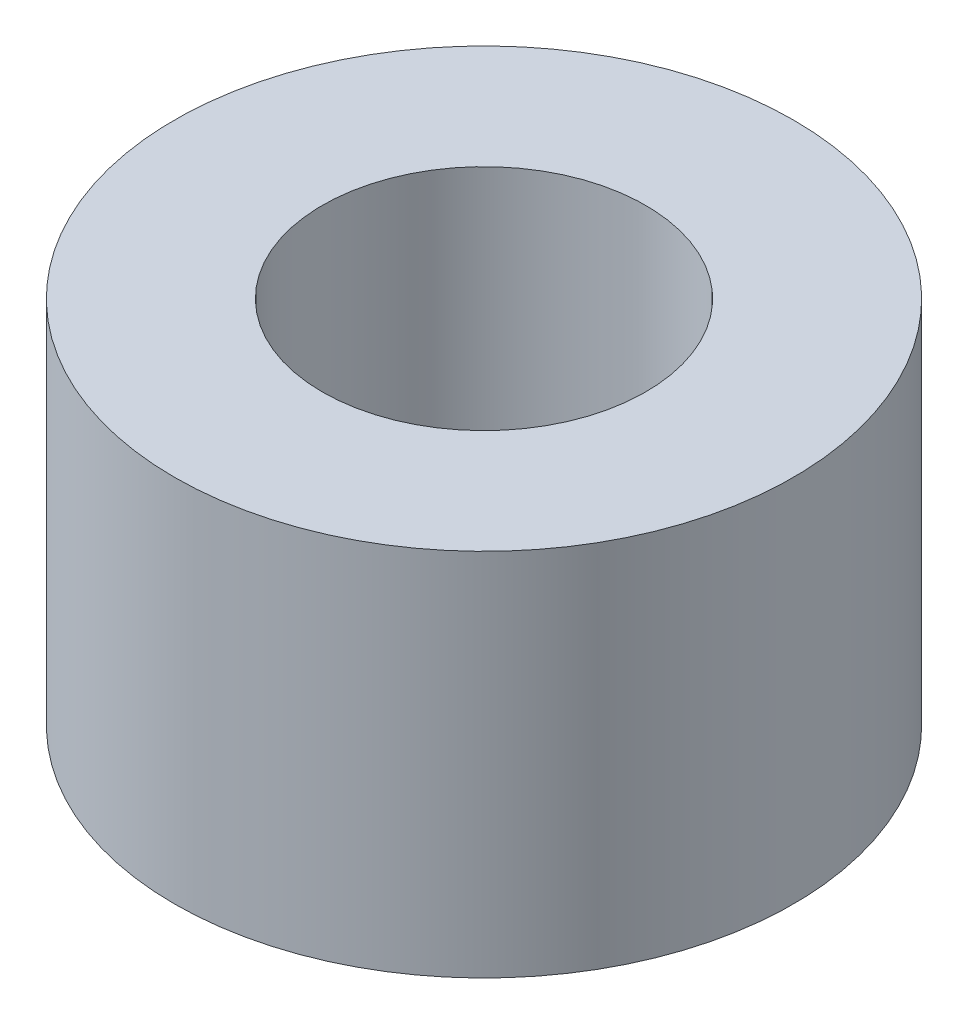
ISO-10303-21;
HEADER;
FILE_DESCRIPTION(('STEP AP214'),'2;1');
FILE_NAME('part.step','',(''),(''),'','','');
FILE_SCHEMA(('AUTOMOTIVE_DESIGN { 1 0 10303 214 1 1 1 1 }'));
ENDSEC;
DATA;
#1=APPLICATION_CONTEXT('core data for automotive mechanical design processes');
#2=APPLICATION_PROTOCOL_DEFINITION('international standard','automotive_design',2000,#1);
#3=PRODUCT_CONTEXT('',#1,'mechanical');
#4=PRODUCT('Part','Part','',(#3));
#5=PRODUCT_RELATED_PRODUCT_CATEGORY('part','',(#4));
#6=PRODUCT_DEFINITION_FORMATION('','',#4);
#7=PRODUCT_DEFINITION_CONTEXT('part definition',#1,'design');
#8=PRODUCT_DEFINITION('design','',#6,#7);
#9=PRODUCT_DEFINITION_SHAPE('','',#8);
#10=(LENGTH_UNIT() NAMED_UNIT(*) SI_UNIT(.MILLI.,.METRE.));
#11=(NAMED_UNIT(*) PLANE_ANGLE_UNIT() SI_UNIT($,.RADIAN.));
#12=(NAMED_UNIT(*) SI_UNIT($,.STERADIAN.) SOLID_ANGLE_UNIT());
#13=UNCERTAINTY_MEASURE_WITH_UNIT(LENGTH_MEASURE(1.E-05),#10,'distance_accuracy_value','');
#14=(GEOMETRIC_REPRESENTATION_CONTEXT(3) GLOBAL_UNCERTAINTY_ASSIGNED_CONTEXT((#13)) GLOBAL_UNIT_ASSIGNED_CONTEXT((#10,
#11,#12)) REPRESENTATION_CONTEXT('',''));
#15=CARTESIAN_POINT('',(0.,0.,0.));
#16=DIRECTION('',(0.,0.,1.));
#17=DIRECTION('',(1.,0.,0.));
#18=AXIS2_PLACEMENT_3D('',#15,#16,#17);
#19=CARTESIAN_POINT('',(0.,4.,0.));
#20=DIRECTION('',(0.,1.,0.));
#21=DIRECTION('',(0.,0.,1.));
#22=AXIS2_PLACEMENT_3D('',#19,#20,#21);
#23=PLANE('',#22);
#24=CARTESIAN_POINT('',(0.,4.,0.));
#25=DIRECTION('',(0.,1.,0.));
#26=DIRECTION('',(0.,0.,1.));
#27=AXIS2_PLACEMENT_3D('',#24,#25,#26);
#28=CIRCLE('',#27,3.35);
#29=CARTESIAN_POINT('',(0.,4.,3.35));
#30=VERTEX_POINT('',#29);
#31=EDGE_CURVE('E10',#30,#30,#28,.T.);
#32=ORIENTED_EDGE('',*,*,#31,.T.);
#33=EDGE_LOOP('',(#32));
#34=FACE_BOUND('',#33,.T.);
#35=CARTESIAN_POINT('',(0.,4.,0.));
#36=DIRECTION('',(0.,1.,0.));
#37=DIRECTION('',(0.,0.,1.));
#38=AXIS2_PLACEMENT_3D('',#35,#36,#37);
#39=CIRCLE('',#38,1.75);
#40=CARTESIAN_POINT('',(0.,4.,1.75));
#41=VERTEX_POINT('',#40);
#42=EDGE_CURVE('E50',#41,#41,#39,.T.);
#43=ORIENTED_EDGE('',*,*,#42,.F.);
#44=EDGE_LOOP('',(#43));
#45=FACE_BOUND('',#44,.T.);
#46=ADVANCED_FACE('F37',(#34,#45),#23,.T.);
#47=CARTESIAN_POINT('',(0.,0.,0.));
#48=DIRECTION('',(0.,1.,0.));
#49=DIRECTION('',(0.,0.,1.));
#50=AXIS2_PLACEMENT_3D('',#47,#48,#49);
#51=PLANE('',#50);
#52=CARTESIAN_POINT('',(0.,0.,0.));
#53=DIRECTION('',(0.,1.,0.));
#54=DIRECTION('',(0.,0.,1.));
#55=AXIS2_PLACEMENT_3D('',#52,#53,#54);
#56=CIRCLE('',#55,3.35);
#57=CARTESIAN_POINT('',(0.,0.,3.35));
#58=VERTEX_POINT('',#57);
#59=EDGE_CURVE('E41',#58,#58,#56,.T.);
#60=ORIENTED_EDGE('',*,*,#59,.F.);
#61=EDGE_LOOP('',(#60));
#62=FACE_BOUND('',#61,.T.);
#63=CARTESIAN_POINT('',(0.,0.,0.));
#64=DIRECTION('',(0.,1.,0.));
#65=DIRECTION('',(0.,0.,1.));
#66=AXIS2_PLACEMENT_3D('',#63,#64,#65);
#67=CIRCLE('',#66,1.75);
#68=CARTESIAN_POINT('',(0.,0.,1.75));
#69=VERTEX_POINT('',#68);
#70=EDGE_CURVE('E52',#69,#69,#67,.T.);
#71=ORIENTED_EDGE('',*,*,#70,.T.);
#72=EDGE_LOOP('',(#71));
#73=FACE_BOUND('',#72,.T.);
#74=ADVANCED_FACE('F64',(#62,#73),#51,.F.);
#75=CARTESIAN_POINT('',(0.,4.,0.));
#76=DIRECTION('',(0.,-1.,0.));
#77=DIRECTION('',(0.,0.,-1.));
#78=AXIS2_PLACEMENT_3D('',#75,#76,#77);
#79=CYLINDRICAL_SURFACE('',#78,3.35);
#80=ORIENTED_EDGE('',*,*,#31,.F.);
#81=EDGE_LOOP('',(#80));
#82=FACE_BOUND('',#81,.T.);
#83=ORIENTED_EDGE('',*,*,#59,.T.);
#84=EDGE_LOOP('',(#83));
#85=FACE_BOUND('',#84,.T.);
#86=ADVANCED_FACE('F39',(#82,#85),#79,.T.);
#87=CARTESIAN_POINT('',(0.,4.,0.));
#88=DIRECTION('',(0.,-1.,0.));
#89=DIRECTION('',(0.,0.,-1.));
#90=AXIS2_PLACEMENT_3D('',#87,#88,#89);
#91=CYLINDRICAL_SURFACE('',#90,1.75);
#92=ORIENTED_EDGE('',*,*,#42,.T.);
#93=EDGE_LOOP('',(#92));
#94=FACE_BOUND('',#93,.T.);
#95=ORIENTED_EDGE('',*,*,#70,.F.);
#96=EDGE_LOOP('',(#95));
#97=FACE_BOUND('',#96,.T.);
#98=ADVANCED_FACE('F60',(#94,#97),#91,.F.);
#99=CLOSED_SHELL('',(#46,#74,#86,#98));
#100=MANIFOLD_SOLID_BREP('B2',#99);
#101=ADVANCED_BREP_SHAPE_REPRESENTATION('',(#18,#100),#14);
#102=SHAPE_DEFINITION_REPRESENTATION(#9,#101);
ENDSEC;
END-ISO-10303-21;
